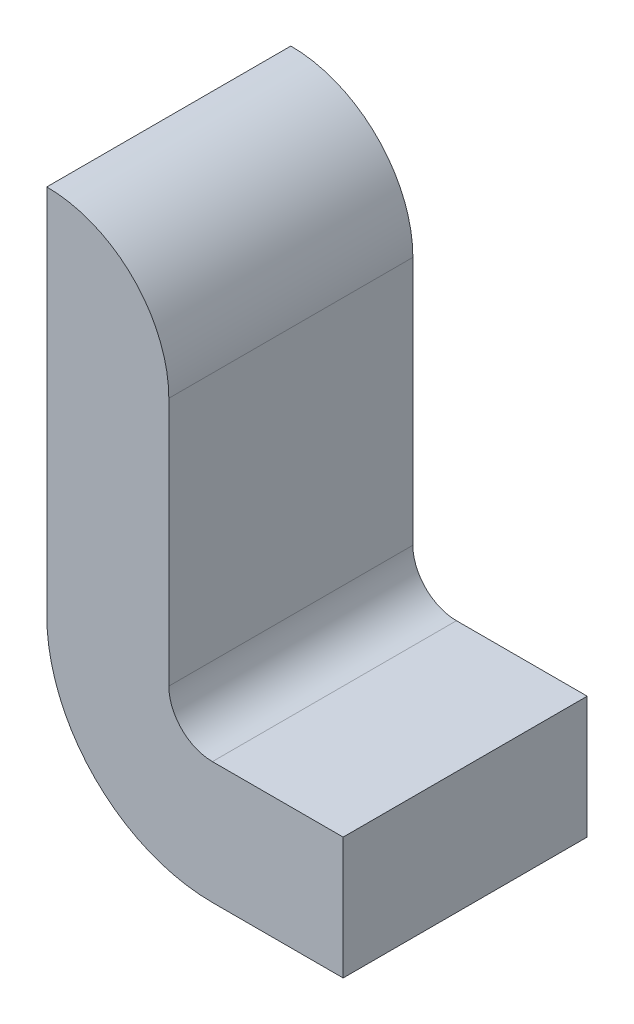
ISO-10303-21;
HEADER;
FILE_DESCRIPTION(('STEP AP214'),'2;1');
FILE_NAME('part.step','',(''),(''),'','','');
FILE_SCHEMA(('AUTOMOTIVE_DESIGN { 1 0 10303 214 1 1 1 1 }'));
ENDSEC;
DATA;
#1=APPLICATION_CONTEXT('core data for automotive mechanical design processes');
#2=APPLICATION_PROTOCOL_DEFINITION('international standard','automotive_design',2000,#1);
#3=PRODUCT_CONTEXT('',#1,'mechanical');
#4=PRODUCT('Part','Part','',(#3));
#5=PRODUCT_RELATED_PRODUCT_CATEGORY('part','',(#4));
#6=PRODUCT_DEFINITION_FORMATION('','',#4);
#7=PRODUCT_DEFINITION_CONTEXT('part definition',#1,'design');
#8=PRODUCT_DEFINITION('design','',#6,#7);
#9=PRODUCT_DEFINITION_SHAPE('','',#8);
#10=(LENGTH_UNIT() NAMED_UNIT(*) SI_UNIT(.MILLI.,.METRE.));
#11=(NAMED_UNIT(*) PLANE_ANGLE_UNIT() SI_UNIT($,.RADIAN.));
#12=(NAMED_UNIT(*) SI_UNIT($,.STERADIAN.) SOLID_ANGLE_UNIT());
#13=UNCERTAINTY_MEASURE_WITH_UNIT(LENGTH_MEASURE(1.E-05),#10,'distance_accuracy_value','');
#14=(GEOMETRIC_REPRESENTATION_CONTEXT(3) GLOBAL_UNCERTAINTY_ASSIGNED_CONTEXT((#13)) GLOBAL_UNIT_ASSIGNED_CONTEXT((#10,
#11,#12)) REPRESENTATION_CONTEXT('',''));
#15=CARTESIAN_POINT('',(0.,0.,0.));
#16=DIRECTION('',(0.,0.,1.));
#17=DIRECTION('',(1.,0.,0.));
#18=AXIS2_PLACEMENT_3D('',#15,#16,#17);
#19=CARTESIAN_POINT('',(0.425,-0.77,0.));
#20=DIRECTION('',(1.,0.,0.));
#21=DIRECTION('',(0.,0.,-1.));
#22=AXIS2_PLACEMENT_3D('',#19,#20,#21);
#23=PLANE('',#22);
#24=DIRECTION('',(0.,0.,-1.));
#25=VECTOR('',#24,1.);
#26=CARTESIAN_POINT('',(0.425,-0.77,0.));
#27=LINE('',#26,#25);
#28=CARTESIAN_POINT('',(0.425,-0.77,0.));
#29=VERTEX_POINT('',#28);
#30=CARTESIAN_POINT('',(0.425,-0.77,0.35));
#31=VERTEX_POINT('',#30);
#32=EDGE_CURVE('E90',#29,#31,#27,.F.);
#33=ORIENTED_EDGE('',*,*,#32,.F.);
#34=DIRECTION('',(0.,1.,0.));
#35=VECTOR('',#34,1.);
#36=CARTESIAN_POINT('',(0.425,0.,0.));
#37=LINE('',#36,#35);
#38=CARTESIAN_POINT('',(0.425,-0.595,0.));
#39=VERTEX_POINT('',#38);
#40=EDGE_CURVE('E89',#29,#39,#37,.T.);
#41=ORIENTED_EDGE('',*,*,#40,.T.);
#42=DIRECTION('',(0.,0.,1.));
#43=VECTOR('',#42,1.);
#44=CARTESIAN_POINT('',(0.425,-0.595,0.));
#45=LINE('',#44,#43);
#46=CARTESIAN_POINT('',(0.425,-0.595,0.35));
#47=VERTEX_POINT('',#46);
#48=EDGE_CURVE('E81',#47,#39,#45,.F.);
#49=ORIENTED_EDGE('',*,*,#48,.F.);
#50=DIRECTION('',(0.,1.,0.));
#51=VECTOR('',#50,1.);
#52=CARTESIAN_POINT('',(0.425,0.,0.35));
#53=LINE('',#52,#51);
#54=EDGE_CURVE('E85',#31,#47,#53,.T.);
#55=ORIENTED_EDGE('',*,*,#54,.F.);
#56=EDGE_LOOP('',(#33,#41,#49,#55));
#57=FACE_BOUND('',#56,.T.);
#58=ADVANCED_FACE('F16',(#57),#23,.T.);
#59=CARTESIAN_POINT('',(0.425,-0.595,0.));
#60=DIRECTION('',(0.,1.,0.));
#61=DIRECTION('',(0.,0.,1.));
#62=AXIS2_PLACEMENT_3D('',#59,#60,#61);
#63=PLANE('',#62);
#64=DIRECTION('',(1.,0.,0.));
#65=VECTOR('',#64,1.);
#66=CARTESIAN_POINT('',(0.,-0.595,0.));
#67=LINE('',#66,#65);
#68=CARTESIAN_POINT('',(0.2375,-0.595,0.));
#69=VERTEX_POINT('',#68);
#70=EDGE_CURVE('E93',#39,#69,#67,.F.);
#71=ORIENTED_EDGE('',*,*,#70,.T.);
#72=DIRECTION('',(0.,0.,1.));
#73=VECTOR('',#72,1.);
#74=CARTESIAN_POINT('',(0.2375,-0.595,-0.45626));
#75=LINE('',#74,#73);
#76=CARTESIAN_POINT('',(0.2375,-0.595,0.35));
#77=VERTEX_POINT('',#76);
#78=EDGE_CURVE('E72',#69,#77,#75,.T.);
#79=ORIENTED_EDGE('',*,*,#78,.T.);
#80=DIRECTION('',(1.,0.,0.));
#81=VECTOR('',#80,1.);
#82=CARTESIAN_POINT('',(0.,-0.595,0.35));
#83=LINE('',#82,#81);
#84=EDGE_CURVE('E98',#47,#77,#83,.F.);
#85=ORIENTED_EDGE('',*,*,#84,.F.);
#86=ORIENTED_EDGE('',*,*,#48,.T.);
#87=EDGE_LOOP('',(#71,#79,#85,#86));
#88=FACE_BOUND('',#87,.T.);
#89=ADVANCED_FACE('F96',(#88),#63,.T.);
#90=CARTESIAN_POINT('',(0.2375,-0.5325,-0.45626));
#91=DIRECTION('',(0.,0.,1.));
#92=DIRECTION('',(1.,0.,0.));
#93=AXIS2_PLACEMENT_3D('',#90,#91,#92);
#94=CYLINDRICAL_SURFACE('',#93,0.0625);
#95=DIRECTION('',(0.,0.,-1.));
#96=VECTOR('',#95,1.);
#97=CARTESIAN_POINT('',(0.175,-0.5325,0.));
#98=LINE('',#97,#96);
#99=CARTESIAN_POINT('',(0.175,-0.5325,0.35));
#100=VERTEX_POINT('',#99);
#101=CARTESIAN_POINT('',(0.175,-0.5325,0.));
#102=VERTEX_POINT('',#101);
#103=EDGE_CURVE('E141',#100,#102,#98,.T.);
#104=ORIENTED_EDGE('',*,*,#103,.F.);
#105=CARTESIAN_POINT('',(0.2375,-0.5325,0.35));
#106=DIRECTION('',(0.,0.,1.));
#107=DIRECTION('',(1.,0.,0.));
#108=AXIS2_PLACEMENT_3D('',#105,#106,#107);
#109=CIRCLE('',#108,0.0625);
#110=EDGE_CURVE('E19',#77,#100,#109,.F.);
#111=ORIENTED_EDGE('',*,*,#110,.F.);
#112=ORIENTED_EDGE('',*,*,#78,.F.);
#113=CARTESIAN_POINT('',(0.2375,-0.5325,0.));
#114=DIRECTION('',(0.,0.,1.));
#115=DIRECTION('',(1.,0.,0.));
#116=AXIS2_PLACEMENT_3D('',#113,#114,#115);
#117=CIRCLE('',#116,0.0625);
#118=EDGE_CURVE('E103',#69,#102,#117,.F.);
#119=ORIENTED_EDGE('',*,*,#118,.T.);
#120=EDGE_LOOP('',(#104,#111,#112,#119));
#121=FACE_BOUND('',#120,.T.);
#122=ADVANCED_FACE('F185',(#121),#94,.F.);
#123=CARTESIAN_POINT('',(0.175,-0.595,0.));
#124=DIRECTION('',(1.,0.,0.));
#125=DIRECTION('',(0.,0.,-1.));
#126=AXIS2_PLACEMENT_3D('',#123,#124,#125);
#127=PLANE('',#126);
#128=DIRECTION('',(0.,1.,0.));
#129=VECTOR('',#128,1.);
#130=CARTESIAN_POINT('',(0.175,0.,0.35));
#131=LINE('',#130,#129);
#132=CARTESIAN_POINT('',(0.175,-0.175,0.35));
#133=VERTEX_POINT('',#132);
#134=EDGE_CURVE('E127',#100,#133,#131,.T.);
#135=ORIENTED_EDGE('',*,*,#134,.F.);
#136=ORIENTED_EDGE('',*,*,#103,.T.);
#137=DIRECTION('',(0.,1.,0.));
#138=VECTOR('',#137,1.);
#139=CARTESIAN_POINT('',(0.175,0.,0.));
#140=LINE('',#139,#138);
#141=CARTESIAN_POINT('',(0.175,-0.175,0.));
#142=VERTEX_POINT('',#141);
#143=EDGE_CURVE('E105',#102,#142,#140,.T.);
#144=ORIENTED_EDGE('',*,*,#143,.T.);
#145=DIRECTION('',(0.,0.,-1.));
#146=VECTOR('',#145,1.);
#147=CARTESIAN_POINT('',(0.175,-0.175,0.80626));
#148=LINE('',#147,#146);
#149=EDGE_CURVE('E112',#133,#142,#148,.T.);
#150=ORIENTED_EDGE('',*,*,#149,.F.);
#151=EDGE_LOOP('',(#135,#136,#144,#150));
#152=FACE_BOUND('',#151,.T.);
#153=ADVANCED_FACE('F170',(#152),#127,.T.);
#154=CARTESIAN_POINT('',(0.,-0.77,0.));
#155=DIRECTION('',(0.,-1.,0.));
#156=DIRECTION('',(0.,0.,-1.));
#157=AXIS2_PLACEMENT_3D('',#154,#155,#156);
#158=PLANE('',#157);
#159=DIRECTION('',(0.,0.,-1.));
#160=VECTOR('',#159,1.);
#161=CARTESIAN_POINT('',(0.2375,-0.77,0.80626));
#162=LINE('',#161,#160);
#163=CARTESIAN_POINT('',(0.2375,-0.77,0.));
#164=VERTEX_POINT('',#163);
#165=CARTESIAN_POINT('',(0.2375,-0.77,0.35));
#166=VERTEX_POINT('',#165);
#167=EDGE_CURVE('E134',#164,#166,#162,.F.);
#168=ORIENTED_EDGE('',*,*,#167,.F.);
#169=DIRECTION('',(1.,0.,0.));
#170=VECTOR('',#169,1.);
#171=CARTESIAN_POINT('',(0.,-0.77,0.));
#172=LINE('',#171,#170);
#173=EDGE_CURVE('E94',#164,#29,#172,.T.);
#174=ORIENTED_EDGE('',*,*,#173,.T.);
#175=ORIENTED_EDGE('',*,*,#32,.T.);
#176=DIRECTION('',(1.,0.,0.));
#177=VECTOR('',#176,1.);
#178=CARTESIAN_POINT('',(0.,-0.77,0.35));
#179=LINE('',#178,#177);
#180=EDGE_CURVE('E123',#166,#31,#179,.T.);
#181=ORIENTED_EDGE('',*,*,#180,.F.);
#182=EDGE_LOOP('',(#168,#174,#175,#181));
#183=FACE_BOUND('',#182,.T.);
#184=ADVANCED_FACE('F176',(#183),#158,.T.);
#185=CARTESIAN_POINT('',(0.,0.,0.35));
#186=DIRECTION('',(0.,0.,1.));
#187=DIRECTION('',(1.,0.,0.));
#188=AXIS2_PLACEMENT_3D('',#185,#186,#187);
#189=PLANE('',#188);
#190=CARTESIAN_POINT('',(0.2375,-0.5325,0.35));
#191=DIRECTION('',(0.,0.,-1.));
#192=DIRECTION('',(-1.,0.,0.));
#193=AXIS2_PLACEMENT_3D('',#190,#191,#192);
#194=CIRCLE('',#193,0.2375);
#195=CARTESIAN_POINT('',(0.,-0.5325,0.35));
#196=VERTEX_POINT('',#195);
#197=EDGE_CURVE('E137',#166,#196,#194,.T.);
#198=ORIENTED_EDGE('',*,*,#197,.F.);
#199=ORIENTED_EDGE('',*,*,#180,.T.);
#200=ORIENTED_EDGE('',*,*,#54,.T.);
#201=ORIENTED_EDGE('',*,*,#84,.T.);
#202=ORIENTED_EDGE('',*,*,#110,.T.);
#203=ORIENTED_EDGE('',*,*,#134,.T.);
#204=CARTESIAN_POINT('',(0.,-0.175,0.35));
#205=DIRECTION('',(0.,0.,-1.));
#206=DIRECTION('',(-1.,0.,0.));
#207=AXIS2_PLACEMENT_3D('',#204,#205,#206);
#208=CIRCLE('',#207,0.175);
#209=CARTESIAN_POINT('',(0.,0.,0.35));
#210=VERTEX_POINT('',#209);
#211=EDGE_CURVE('E126',#210,#133,#208,.T.);
#212=ORIENTED_EDGE('',*,*,#211,.F.);
#213=DIRECTION('',(0.,1.,0.));
#214=VECTOR('',#213,1.);
#215=CARTESIAN_POINT('',(0.,0.,0.35));
#216=LINE('',#215,#214);
#217=EDGE_CURVE('E118',#196,#210,#216,.T.);
#218=ORIENTED_EDGE('',*,*,#217,.F.);
#219=EDGE_LOOP('',(#198,#199,#200,#201,#202,#203,#212,#218));
#220=FACE_BOUND('',#219,.T.);
#221=ADVANCED_FACE('F166',(#220),#189,.T.);
#222=CARTESIAN_POINT('',(0.,-0.175,0.80626));
#223=DIRECTION('',(0.,0.,-1.));
#224=DIRECTION('',(-1.,0.,0.));
#225=AXIS2_PLACEMENT_3D('',#222,#223,#224);
#226=CYLINDRICAL_SURFACE('',#225,0.175);
#227=ORIENTED_EDGE('',*,*,#149,.T.);
#228=CARTESIAN_POINT('',(0.,-0.175,0.));
#229=DIRECTION('',(0.,0.,-1.));
#230=DIRECTION('',(-1.,0.,0.));
#231=AXIS2_PLACEMENT_3D('',#228,#229,#230);
#232=CIRCLE('',#231,0.175);
#233=CARTESIAN_POINT('',(0.,0.,0.));
#234=VERTEX_POINT('',#233);
#235=EDGE_CURVE('E138',#142,#234,#232,.F.);
#236=ORIENTED_EDGE('',*,*,#235,.T.);
#237=DIRECTION('',(0.,0.,1.));
#238=VECTOR('',#237,1.);
#239=CARTESIAN_POINT('',(0.,0.,0.));
#240=LINE('',#239,#238);
#241=EDGE_CURVE('E115',#210,#234,#240,.F.);
#242=ORIENTED_EDGE('',*,*,#241,.F.);
#243=ORIENTED_EDGE('',*,*,#211,.T.);
#244=EDGE_LOOP('',(#227,#236,#242,#243));
#245=FACE_BOUND('',#244,.T.);
#246=ADVANCED_FACE('F161',(#245),#226,.T.);
#247=CARTESIAN_POINT('',(0.,0.,0.));
#248=DIRECTION('',(0.,0.,1.));
#249=DIRECTION('',(1.,0.,0.));
#250=AXIS2_PLACEMENT_3D('',#247,#248,#249);
#251=PLANE('',#250);
#252=DIRECTION('',(0.,1.,0.));
#253=VECTOR('',#252,1.);
#254=CARTESIAN_POINT('',(0.,0.,0.));
#255=LINE('',#254,#253);
#256=CARTESIAN_POINT('',(0.,-0.5325,0.));
#257=VERTEX_POINT('',#256);
#258=EDGE_CURVE('E25',#234,#257,#255,.F.);
#259=ORIENTED_EDGE('',*,*,#258,.F.);
#260=ORIENTED_EDGE('',*,*,#235,.F.);
#261=ORIENTED_EDGE('',*,*,#143,.F.);
#262=ORIENTED_EDGE('',*,*,#118,.F.);
#263=ORIENTED_EDGE('',*,*,#70,.F.);
#264=ORIENTED_EDGE('',*,*,#40,.F.);
#265=ORIENTED_EDGE('',*,*,#173,.F.);
#266=CARTESIAN_POINT('',(0.2375,-0.5325,0.));
#267=DIRECTION('',(0.,0.,-1.));
#268=DIRECTION('',(-1.,0.,0.));
#269=AXIS2_PLACEMENT_3D('',#266,#267,#268);
#270=CIRCLE('',#269,0.2375);
#271=EDGE_CURVE('E34',#257,#164,#270,.F.);
#272=ORIENTED_EDGE('',*,*,#271,.F.);
#273=EDGE_LOOP('',(#259,#260,#261,#262,#263,#264,#265,#272));
#274=FACE_BOUND('',#273,.T.);
#275=ADVANCED_FACE('F101',(#274),#251,.F.);
#276=CARTESIAN_POINT('',(0.2375,-0.5325,0.80626));
#277=DIRECTION('',(0.,0.,-1.));
#278=DIRECTION('',(-1.,0.,0.));
#279=AXIS2_PLACEMENT_3D('',#276,#277,#278);
#280=CYLINDRICAL_SURFACE('',#279,0.2375);
#281=DIRECTION('',(0.,0.,1.));
#282=VECTOR('',#281,1.);
#283=CARTESIAN_POINT('',(0.,-0.5325,0.));
#284=LINE('',#283,#282);
#285=EDGE_CURVE('E11',#257,#196,#284,.T.);
#286=ORIENTED_EDGE('',*,*,#285,.F.);
#287=ORIENTED_EDGE('',*,*,#271,.T.);
#288=ORIENTED_EDGE('',*,*,#167,.T.);
#289=ORIENTED_EDGE('',*,*,#197,.T.);
#290=EDGE_LOOP('',(#286,#287,#288,#289));
#291=FACE_BOUND('',#290,.T.);
#292=ADVANCED_FACE('F174',(#291),#280,.T.);
#293=CARTESIAN_POINT('',(0.,0.,0.));
#294=DIRECTION('',(-1.,0.,0.));
#295=DIRECTION('',(0.,0.,1.));
#296=AXIS2_PLACEMENT_3D('',#293,#294,#295);
#297=PLANE('',#296);
#298=ORIENTED_EDGE('',*,*,#258,.T.);
#299=ORIENTED_EDGE('',*,*,#285,.T.);
#300=ORIENTED_EDGE('',*,*,#217,.T.);
#301=ORIENTED_EDGE('',*,*,#241,.T.);
#302=EDGE_LOOP('',(#298,#299,#300,#301));
#303=FACE_BOUND('',#302,.T.);
#304=ADVANCED_FACE('F172',(#303),#297,.T.);
#305=CLOSED_SHELL('',(#58,#89,#122,#153,#184,#221,#246,#275,#292,#304));
#306=MANIFOLD_SOLID_BREP('B1',#305);
#307=ADVANCED_BREP_SHAPE_REPRESENTATION('',(#18,#306),#14);
#308=SHAPE_DEFINITION_REPRESENTATION(#9,#307);
ENDSEC;
END-ISO-10303-21;
